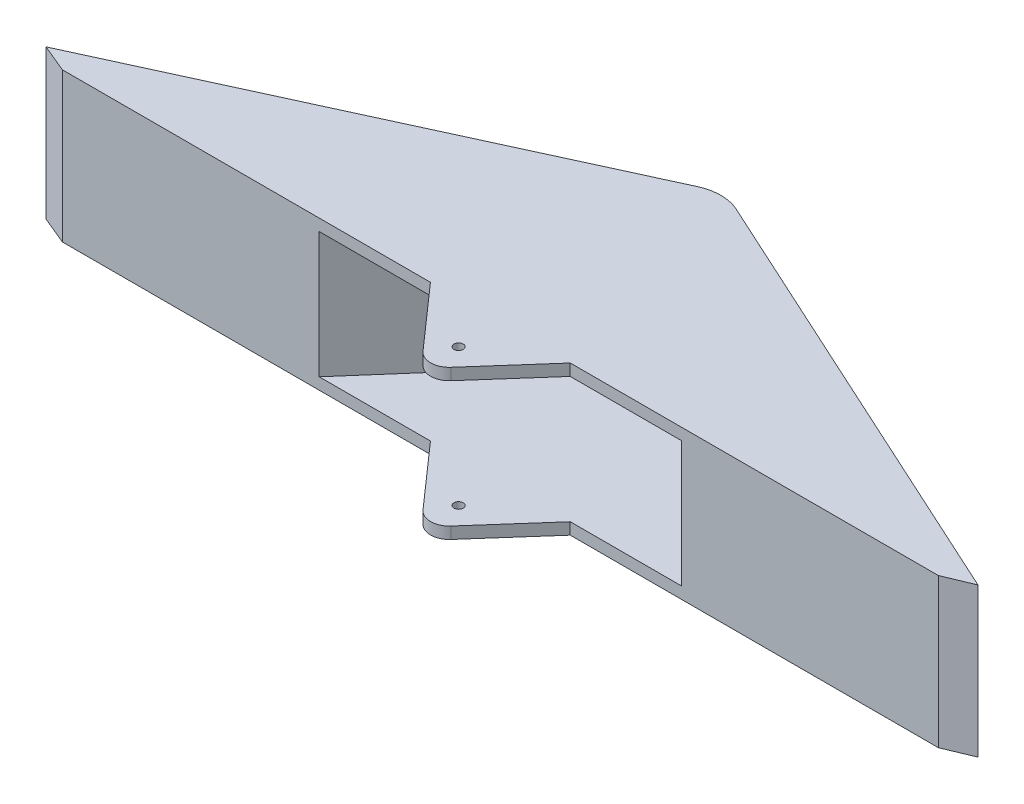
ISO-10303-21;
HEADER;
FILE_DESCRIPTION(('STEP AP214'),'2;1');
FILE_NAME('part.step','',(''),(''),'','','');
FILE_SCHEMA(('AUTOMOTIVE_DESIGN { 1 0 10303 214 1 1 1 1 }'));
ENDSEC;
DATA;
#1=APPLICATION_CONTEXT('core data for automotive mechanical design processes');
#2=APPLICATION_PROTOCOL_DEFINITION('international standard','automotive_design',2000,#1);
#3=PRODUCT_CONTEXT('',#1,'mechanical');
#4=PRODUCT('Part','Part','',(#3));
#5=PRODUCT_RELATED_PRODUCT_CATEGORY('part','',(#4));
#6=PRODUCT_DEFINITION_FORMATION('','',#4);
#7=PRODUCT_DEFINITION_CONTEXT('part definition',#1,'design');
#8=PRODUCT_DEFINITION('design','',#6,#7);
#9=PRODUCT_DEFINITION_SHAPE('','',#8);
#10=(LENGTH_UNIT() NAMED_UNIT(*) SI_UNIT(.MILLI.,.METRE.));
#11=(NAMED_UNIT(*) PLANE_ANGLE_UNIT() SI_UNIT($,.RADIAN.));
#12=(NAMED_UNIT(*) SI_UNIT($,.STERADIAN.) SOLID_ANGLE_UNIT());
#13=UNCERTAINTY_MEASURE_WITH_UNIT(LENGTH_MEASURE(1.E-05),#10,'distance_accuracy_value','');
#14=(GEOMETRIC_REPRESENTATION_CONTEXT(3) GLOBAL_UNCERTAINTY_ASSIGNED_CONTEXT((#13)) GLOBAL_UNIT_ASSIGNED_CONTEXT((#10,
#11,#12)) REPRESENTATION_CONTEXT('',''));
#15=CARTESIAN_POINT('',(0.,0.,0.));
#16=DIRECTION('',(0.,0.,1.));
#17=DIRECTION('',(1.,0.,0.));
#18=AXIS2_PLACEMENT_3D('',#15,#16,#17);
#19=CARTESIAN_POINT('',(-50.,118.756766424241,1.25));
#20=DIRECTION('',(0.,0.,-1.));
#21=DIRECTION('',(-1.,0.,0.));
#22=AXIS2_PLACEMENT_3D('',#19,#20,#21);
#23=PLANE('',#22);
#24=DIRECTION('',(0.,1.,0.));
#25=VECTOR('',#24,1.);
#26=CARTESIAN_POINT('',(-7.5,14.75,1.25));
#27=LINE('',#26,#25);
#28=CARTESIAN_POINT('',(-7.5,14.75,1.25));
#29=VERTEX_POINT('',#28);
#30=CARTESIAN_POINT('',(-7.5,16.,1.25000000000001));
#31=VERTEX_POINT('',#30);
#32=EDGE_CURVE('E57',#29,#31,#27,.T.);
#33=ORIENTED_EDGE('',*,*,#32,.T.);
#34=DIRECTION('',(1.,0.,0.));
#35=VECTOR('',#34,1.);
#36=CARTESIAN_POINT('',(50.,16.,1.25));
#37=LINE('',#36,#35);
#38=CARTESIAN_POINT('',(-47.,16.,1.25));
#39=VERTEX_POINT('',#38);
#40=EDGE_CURVE('E338',#39,#31,#37,.T.);
#41=ORIENTED_EDGE('',*,*,#40,.F.);
#42=DIRECTION('',(0.,-1.,0.));
#43=VECTOR('',#42,1.);
#44=CARTESIAN_POINT('',(-47.,118.756766424241,1.25));
#45=LINE('',#44,#43);
#46=CARTESIAN_POINT('',(-47.,0.,1.25));
#47=VERTEX_POINT('',#46);
#48=EDGE_CURVE('E346',#39,#47,#45,.T.);
#49=ORIENTED_EDGE('',*,*,#48,.T.);
#50=DIRECTION('',(-1.,0.,0.));
#51=VECTOR('',#50,1.);
#52=CARTESIAN_POINT('',(-50.,0.,1.25));
#53=LINE('',#52,#51);
#54=CARTESIAN_POINT('',(-7.5,0.,1.25));
#55=VERTEX_POINT('',#54);
#56=EDGE_CURVE('E335',#55,#47,#53,.T.);
#57=ORIENTED_EDGE('',*,*,#56,.F.);
#58=DIRECTION('',(0.,-1.,0.));
#59=VECTOR('',#58,1.);
#60=CARTESIAN_POINT('',(-7.5,1.25,1.25));
#61=LINE('',#60,#59);
#62=CARTESIAN_POINT('',(-7.5,1.25,1.25));
#63=VERTEX_POINT('',#62);
#64=EDGE_CURVE('E243',#63,#55,#61,.T.);
#65=ORIENTED_EDGE('',*,*,#64,.F.);
#66=DIRECTION('',(1.,0.,0.));
#67=VECTOR('',#66,1.);
#68=CARTESIAN_POINT('',(19.4318799434697,1.25,1.25000000000001));
#69=LINE('',#68,#67);
#70=CARTESIAN_POINT('',(-19.4318799434697,1.25,1.25));
#71=VERTEX_POINT('',#70);
#72=EDGE_CURVE('E284',#71,#63,#69,.T.);
#73=ORIENTED_EDGE('',*,*,#72,.F.);
#74=DIRECTION('',(0.,-1.,0.));
#75=VECTOR('',#74,1.);
#76=CARTESIAN_POINT('',(-19.4318799434697,118.756766424241,1.25));
#77=LINE('',#76,#75);
#78=CARTESIAN_POINT('',(-19.4318799434697,14.75,1.25));
#79=VERTEX_POINT('',#78);
#80=EDGE_CURVE('E405',#79,#71,#77,.T.);
#81=ORIENTED_EDGE('',*,*,#80,.F.);
#82=DIRECTION('',(1.,0.,0.));
#83=VECTOR('',#82,1.);
#84=CARTESIAN_POINT('',(19.4318799434697,14.75,1.25000000000001));
#85=LINE('',#84,#83);
#86=EDGE_CURVE('E294',#79,#29,#85,.T.);
#87=ORIENTED_EDGE('',*,*,#86,.T.);
#88=EDGE_LOOP('',(#33,#41,#49,#57,#65,#73,#81,#87));
#89=FACE_BOUND('',#88,.T.);
#90=ADVANCED_FACE('F32',(#89),#23,.F.);
#91=DIRECTION('',(0.,1.,0.));
#92=VECTOR('',#91,1.);
#93=CARTESIAN_POINT('',(7.5,14.75,1.25));
#94=LINE('',#93,#92);
#95=CARTESIAN_POINT('',(7.5,14.75,1.25));
#96=VERTEX_POINT('',#95);
#97=CARTESIAN_POINT('',(7.5,16.,1.25000000000001));
#98=VERTEX_POINT('',#97);
#99=EDGE_CURVE('E237',#96,#98,#94,.T.);
#100=ORIENTED_EDGE('',*,*,#99,.F.);
#101=CARTESIAN_POINT('',(19.4318799434697,14.75,1.25000000000001));
#102=VERTEX_POINT('',#101);
#103=EDGE_CURVE('E293',#96,#102,#85,.T.);
#104=ORIENTED_EDGE('',*,*,#103,.T.);
#105=DIRECTION('',(0.,-1.,0.));
#106=VECTOR('',#105,1.);
#107=CARTESIAN_POINT('',(19.4318799434697,118.756766424241,1.25000000000001));
#108=LINE('',#107,#106);
#109=CARTESIAN_POINT('',(19.4318799434697,1.25,1.25000000000001));
#110=VERTEX_POINT('',#109);
#111=EDGE_CURVE('E399',#102,#110,#108,.T.);
#112=ORIENTED_EDGE('',*,*,#111,.T.);
#113=CARTESIAN_POINT('',(7.5,1.25,1.25));
#114=VERTEX_POINT('',#113);
#115=EDGE_CURVE('E252',#114,#110,#69,.T.);
#116=ORIENTED_EDGE('',*,*,#115,.F.);
#117=DIRECTION('',(0.,-1.,0.));
#118=VECTOR('',#117,1.);
#119=CARTESIAN_POINT('',(7.5,1.25,1.25));
#120=LINE('',#119,#118);
#121=CARTESIAN_POINT('',(7.5,0.,1.25));
#122=VERTEX_POINT('',#121);
#123=EDGE_CURVE('E255',#114,#122,#120,.T.);
#124=ORIENTED_EDGE('',*,*,#123,.T.);
#125=CARTESIAN_POINT('',(46.9999999999999,0.,1.25));
#126=VERTEX_POINT('',#125);
#127=EDGE_CURVE('E342',#126,#122,#53,.T.);
#128=ORIENTED_EDGE('',*,*,#127,.F.);
#129=DIRECTION('',(0.,1.,0.));
#130=VECTOR('',#129,1.);
#131=CARTESIAN_POINT('',(46.9999999999999,118.756766424241,1.25));
#132=LINE('',#131,#130);
#133=CARTESIAN_POINT('',(47.0000000000001,16.,1.24999999999998));
#134=VERTEX_POINT('',#133);
#135=EDGE_CURVE('E351',#126,#134,#132,.T.);
#136=ORIENTED_EDGE('',*,*,#135,.T.);
#137=EDGE_CURVE('E49',#98,#134,#37,.T.);
#138=ORIENTED_EDGE('',*,*,#137,.F.);
#139=EDGE_LOOP('',(#100,#104,#112,#116,#124,#128,#136,#138));
#140=FACE_BOUND('',#139,.T.);
#141=ADVANCED_FACE('F459',(#140),#23,.F.);
#142=CARTESIAN_POINT('',(20.,118.756766424241,0.));
#143=DIRECTION('',(0.,0.,1.));
#144=DIRECTION('',(1.,0.,0.));
#145=AXIS2_PLACEMENT_3D('',#142,#143,#144);
#146=PLANE('',#145);
#147=DIRECTION('',(1.,0.,0.));
#148=VECTOR('',#147,1.);
#149=CARTESIAN_POINT('',(20.,14.75,0.));
#150=LINE('',#149,#148);
#151=CARTESIAN_POINT('',(20.,14.75,0.));
#152=VERTEX_POINT('',#151);
#153=CARTESIAN_POINT('',(50.,14.75,0.));
#154=VERTEX_POINT('',#153);
#155=EDGE_CURVE('E322',#152,#154,#150,.T.);
#156=ORIENTED_EDGE('',*,*,#155,.T.);
#157=DIRECTION('',(0.,-1.,0.));
#158=VECTOR('',#157,1.);
#159=CARTESIAN_POINT('',(50.,118.756766424241,0.));
#160=LINE('',#159,#158);
#161=CARTESIAN_POINT('',(50.,1.25,0.));
#162=VERTEX_POINT('',#161);
#163=EDGE_CURVE('E343',#154,#162,#160,.T.);
#164=ORIENTED_EDGE('',*,*,#163,.T.);
#165=DIRECTION('',(1.,0.,0.));
#166=VECTOR('',#165,1.);
#167=CARTESIAN_POINT('',(20.,1.25,0.));
#168=LINE('',#167,#166);
#169=CARTESIAN_POINT('',(20.,1.25,0.));
#170=VERTEX_POINT('',#169);
#171=EDGE_CURVE('E381',#170,#162,#168,.T.);
#172=ORIENTED_EDGE('',*,*,#171,.F.);
#173=DIRECTION('',(0.,-1.,0.));
#174=VECTOR('',#173,1.);
#175=CARTESIAN_POINT('',(20.,118.756766424241,0.));
#176=LINE('',#175,#174);
#177=EDGE_CURVE('E398',#152,#170,#176,.T.);
#178=ORIENTED_EDGE('',*,*,#177,.F.);
#179=EDGE_LOOP('',(#156,#164,#172,#178));
#180=FACE_BOUND('',#179,.T.);
#181=ADVANCED_FACE('F428',(#180),#146,.F.);
#182=CARTESIAN_POINT('',(0.753370803500888,118.756766424241,-22.0497837914261));
#183=DIRECTION('',(-0.753370803500884,0.,0.657595949221429));
#184=DIRECTION('',(0.657595949221429,0.,0.753370803500884));
#185=AXIS2_PLACEMENT_3D('',#182,#183,#184);
#186=PLANE('',#185);
#187=DIRECTION('',(0.657595949221429,0.,0.753370803500884));
#188=VECTOR('',#187,1.);
#189=CARTESIAN_POINT('',(0.753370803500888,14.75,-22.0497837914261));
#190=LINE('',#189,#188);
#191=CARTESIAN_POINT('',(0.753370803500888,14.75,-22.0497837914261));
#192=VERTEX_POINT('',#191);
#193=EDGE_CURVE('E319',#192,#152,#190,.T.);
#194=ORIENTED_EDGE('',*,*,#193,.T.);
#195=ORIENTED_EDGE('',*,*,#177,.T.);
#196=DIRECTION('',(0.657595949221429,0.,0.753370803500884));
#197=VECTOR('',#196,1.);
#198=CARTESIAN_POINT('',(0.753370803500888,1.25,-22.0497837914261));
#199=LINE('',#198,#197);
#200=CARTESIAN_POINT('',(0.753370803500888,1.25,-22.0497837914261));
#201=VERTEX_POINT('',#200);
#202=EDGE_CURVE('E384',#201,#170,#199,.T.);
#203=ORIENTED_EDGE('',*,*,#202,.F.);
#204=DIRECTION('',(0.,-1.,0.));
#205=VECTOR('',#204,1.);
#206=CARTESIAN_POINT('',(0.753370803500888,118.756766424241,-22.0497837914261));
#207=LINE('',#206,#205);
#208=EDGE_CURVE('E416',#192,#201,#207,.T.);
#209=ORIENTED_EDGE('',*,*,#208,.F.);
#210=EDGE_LOOP('',(#194,#195,#203,#209));
#211=FACE_BOUND('',#210,.T.);
#212=ADVANCED_FACE('F420',(#211),#186,.F.);
#213=CARTESIAN_POINT('',(0.,118.756766424241,-21.3921878422046));
#214=DIRECTION('',(0.,-1.,0.));
#215=DIRECTION('',(0.,0.,-1.));
#216=AXIS2_PLACEMENT_3D('',#213,#214,#215);
#217=CYLINDRICAL_SURFACE('',#216,1.);
#218=CARTESIAN_POINT('',(0.,14.75,-21.3921878422046));
#219=DIRECTION('',(0.,-1.,0.));
#220=DIRECTION('',(0.,0.,1.));
#221=AXIS2_PLACEMENT_3D('',#218,#219,#220);
#222=CIRCLE('',#221,1.);
#223=CARTESIAN_POINT('',(-0.753370803500882,14.75,-22.0497837914261));
#224=VERTEX_POINT('',#223);
#225=EDGE_CURVE('E316',#224,#192,#222,.T.);
#226=ORIENTED_EDGE('',*,*,#225,.T.);
#227=ORIENTED_EDGE('',*,*,#208,.T.);
#228=CARTESIAN_POINT('',(0.,1.25,-21.3921878422046));
#229=DIRECTION('',(0.,-1.,0.));
#230=DIRECTION('',(0.,0.,1.));
#231=AXIS2_PLACEMENT_3D('',#228,#229,#230);
#232=CIRCLE('',#231,1.);
#233=CARTESIAN_POINT('',(-0.753370803500882,1.25,-22.0497837914261));
#234=VERTEX_POINT('',#233);
#235=EDGE_CURVE('E387',#234,#201,#232,.T.);
#236=ORIENTED_EDGE('',*,*,#235,.F.);
#237=DIRECTION('',(0.,-1.,0.));
#238=VECTOR('',#237,1.);
#239=CARTESIAN_POINT('',(-0.753370803500882,118.756766424241,-22.0497837914261));
#240=LINE('',#239,#238);
#241=EDGE_CURVE('E414',#224,#234,#240,.T.);
#242=ORIENTED_EDGE('',*,*,#241,.F.);
#243=EDGE_LOOP('',(#226,#227,#236,#242));
#244=FACE_BOUND('',#243,.T.);
#245=ADVANCED_FACE('F533',(#244),#217,.T.);
#246=CARTESIAN_POINT('',(-20.,118.756766424241,0.));
#247=DIRECTION('',(0.753370803500884,0.,0.65759594922143));
#248=DIRECTION('',(0.65759594922143,0.,-0.753370803500884));
#249=AXIS2_PLACEMENT_3D('',#246,#247,#248);
#250=PLANE('',#249);
#251=DIRECTION('',(0.65759594922143,0.,-0.753370803500884));
#252=VECTOR('',#251,1.);
#253=CARTESIAN_POINT('',(-0.753370803500882,14.75,-22.0497837914261));
#254=LINE('',#253,#252);
#255=CARTESIAN_POINT('',(-20.,14.75,0.));
#256=VERTEX_POINT('',#255);
#257=EDGE_CURVE('E313',#256,#224,#254,.T.);
#258=ORIENTED_EDGE('',*,*,#257,.T.);
#259=ORIENTED_EDGE('',*,*,#241,.T.);
#260=DIRECTION('',(0.65759594922143,0.,-0.753370803500884));
#261=VECTOR('',#260,1.);
#262=CARTESIAN_POINT('',(-0.753370803500882,1.25,-22.0497837914261));
#263=LINE('',#262,#261);
#264=CARTESIAN_POINT('',(-20.,1.25,0.));
#265=VERTEX_POINT('',#264);
#266=EDGE_CURVE('E390',#265,#234,#263,.T.);
#267=ORIENTED_EDGE('',*,*,#266,.F.);
#268=DIRECTION('',(0.,-1.,0.));
#269=VECTOR('',#268,1.);
#270=CARTESIAN_POINT('',(-20.,118.756766424241,0.));
#271=LINE('',#270,#269);
#272=EDGE_CURVE('E412',#256,#265,#271,.T.);
#273=ORIENTED_EDGE('',*,*,#272,.F.);
#274=EDGE_LOOP('',(#258,#259,#267,#273));
#275=FACE_BOUND('',#274,.T.);
#276=ADVANCED_FACE('F530',(#275),#250,.F.);
#277=CARTESIAN_POINT('',(-50.,118.756766424241,0.));
#278=DIRECTION('',(0.,0.,1.));
#279=DIRECTION('',(1.,0.,0.));
#280=AXIS2_PLACEMENT_3D('',#277,#278,#279);
#281=PLANE('',#280);
#282=DIRECTION('',(1.,0.,0.));
#283=VECTOR('',#282,1.);
#284=CARTESIAN_POINT('',(-20.,14.75,0.));
#285=LINE('',#284,#283);
#286=CARTESIAN_POINT('',(-50.,14.75,0.));
#287=VERTEX_POINT('',#286);
#288=EDGE_CURVE('E302',#287,#256,#285,.T.);
#289=ORIENTED_EDGE('',*,*,#288,.T.);
#290=ORIENTED_EDGE('',*,*,#272,.T.);
#291=DIRECTION('',(1.,0.,0.));
#292=VECTOR('',#291,1.);
#293=CARTESIAN_POINT('',(-20.,1.25,0.));
#294=LINE('',#293,#292);
#295=CARTESIAN_POINT('',(-50.,1.25,0.));
#296=VERTEX_POINT('',#295);
#297=EDGE_CURVE('E371',#296,#265,#294,.T.);
#298=ORIENTED_EDGE('',*,*,#297,.F.);
#299=DIRECTION('',(0.,-1.,0.));
#300=VECTOR('',#299,1.);
#301=CARTESIAN_POINT('',(-50.,118.756766424241,0.));
#302=LINE('',#301,#300);
#303=EDGE_CURVE('E411',#287,#296,#302,.T.);
#304=ORIENTED_EDGE('',*,*,#303,.F.);
#305=EDGE_LOOP('',(#289,#290,#298,#304));
#306=FACE_BOUND('',#305,.T.);
#307=ADVANCED_FACE('F483',(#306),#281,.F.);
#308=CARTESIAN_POINT('',(50.,1.25,0.));
#309=DIRECTION('',(-0.416597790450531,0.,0.909090909090909));
#310=DIRECTION('',(0.909090909090909,0.,0.416597790450531));
#311=AXIS2_PLACEMENT_3D('',#308,#309,#310);
#312=PLANE('',#311);
#313=DIRECTION('',(-0.909090909090909,0.,-0.416597790450531));
#314=VECTOR('',#313,1.);
#315=CARTESIAN_POINT('',(50.,0.,0.));
#316=LINE('',#315,#314);
#317=CARTESIAN_POINT('',(50.,0.,0.));
#318=VERTEX_POINT('',#317);
#319=CARTESIAN_POINT('',(2.08298895225268,0.,-21.9583330202337));
#320=VERTEX_POINT('',#319);
#321=EDGE_CURVE('E374',#318,#320,#316,.T.);
#322=ORIENTED_EDGE('',*,*,#321,.T.);
#323=DIRECTION('',(0.,-1.,0.));
#324=VECTOR('',#323,1.);
#325=CARTESIAN_POINT('',(2.08298895225268,1.25,-21.9583330202337));
#326=LINE('',#325,#324);
#327=CARTESIAN_POINT('',(2.08298895225268,1.25,-21.9583330202337));
#328=VERTEX_POINT('',#327);
#329=EDGE_CURVE('E358',#328,#320,#326,.T.);
#330=ORIENTED_EDGE('',*,*,#329,.F.);
#331=DIRECTION('',(-0.909090909090909,0.,-0.416597790450531));
#332=VECTOR('',#331,1.);
#333=CARTESIAN_POINT('',(50.,1.25,0.));
#334=LINE('',#333,#332);
#335=EDGE_CURVE('E379',#162,#328,#334,.T.);
#336=ORIENTED_EDGE('',*,*,#335,.F.);
#337=DIRECTION('',(0.,-1.,0.));
#338=VECTOR('',#337,1.);
#339=CARTESIAN_POINT('',(50.,1.25,0.));
#340=LINE('',#339,#338);
#341=EDGE_CURVE('E356',#162,#318,#340,.T.);
#342=ORIENTED_EDGE('',*,*,#341,.T.);
#343=EDGE_LOOP('',(#322,#330,#336,#342));
#344=FACE_BOUND('',#343,.T.);
#345=ADVANCED_FACE('F467',(#344),#312,.F.);
#346=CARTESIAN_POINT('',(0.,1.25,-17.4128784747792));
#347=DIRECTION('',(0.,-1.,0.));
#348=DIRECTION('',(0.,0.,-1.));
#349=AXIS2_PLACEMENT_3D('',#346,#347,#348);
#350=CYLINDRICAL_SURFACE('',#349,5.);
#351=CARTESIAN_POINT('',(0.,0.,-17.4128784747792));
#352=DIRECTION('',(0.,1.,0.));
#353=DIRECTION('',(0.,0.,1.));
#354=AXIS2_PLACEMENT_3D('',#351,#352,#353);
#355=CIRCLE('',#354,5.);
#356=CARTESIAN_POINT('',(-2.08298895225267,0.,-21.9583330202337));
#357=VERTEX_POINT('',#356);
#358=EDGE_CURVE('E372',#320,#357,#355,.T.);
#359=ORIENTED_EDGE('',*,*,#358,.T.);
#360=DIRECTION('',(0.,-1.,0.));
#361=VECTOR('',#360,1.);
#362=CARTESIAN_POINT('',(-2.08298895225267,1.25,-21.9583330202337));
#363=LINE('',#362,#361);
#364=CARTESIAN_POINT('',(-2.08298895225267,1.25,-21.9583330202337));
#365=VERTEX_POINT('',#364);
#366=EDGE_CURVE('E361',#365,#357,#363,.T.);
#367=ORIENTED_EDGE('',*,*,#366,.F.);
#368=CARTESIAN_POINT('',(0.,1.25,-17.4128784747792));
#369=DIRECTION('',(0.,1.,0.));
#370=DIRECTION('',(0.,0.,1.));
#371=AXIS2_PLACEMENT_3D('',#368,#369,#370);
#372=CIRCLE('',#371,5.);
#373=EDGE_CURVE('E377',#328,#365,#372,.T.);
#374=ORIENTED_EDGE('',*,*,#373,.F.);
#375=ORIENTED_EDGE('',*,*,#329,.T.);
#376=EDGE_LOOP('',(#359,#367,#374,#375));
#377=FACE_BOUND('',#376,.T.);
#378=ADVANCED_FACE('F470',(#377),#350,.T.);
#379=CARTESIAN_POINT('',(-50.,1.25,0.));
#380=DIRECTION('',(0.416597790450531,0.,0.909090909090909));
#381=DIRECTION('',(0.909090909090909,0.,-0.416597790450531));
#382=AXIS2_PLACEMENT_3D('',#379,#380,#381);
#383=PLANE('',#382);
#384=DIRECTION('',(-0.909090909090909,0.,0.416597790450531));
#385=VECTOR('',#384,1.);
#386=CARTESIAN_POINT('',(-50.,0.,0.));
#387=LINE('',#386,#385);
#388=CARTESIAN_POINT('',(-50.,0.,0.));
#389=VERTEX_POINT('',#388);
#390=EDGE_CURVE('E368',#357,#389,#387,.T.);
#391=ORIENTED_EDGE('',*,*,#390,.T.);
#392=DIRECTION('',(0.,-1.,0.));
#393=VECTOR('',#392,1.);
#394=CARTESIAN_POINT('',(-50.,1.25,0.));
#395=LINE('',#394,#393);
#396=EDGE_CURVE('E364',#296,#389,#395,.T.);
#397=ORIENTED_EDGE('',*,*,#396,.F.);
#398=DIRECTION('',(-0.909090909090909,0.,0.416597790450531));
#399=VECTOR('',#398,1.);
#400=CARTESIAN_POINT('',(-50.,1.25,0.));
#401=LINE('',#400,#399);
#402=EDGE_CURVE('E367',#365,#296,#401,.T.);
#403=ORIENTED_EDGE('',*,*,#402,.F.);
#404=ORIENTED_EDGE('',*,*,#366,.T.);
#405=EDGE_LOOP('',(#391,#397,#403,#404));
#406=FACE_BOUND('',#405,.T.);
#407=ADVANCED_FACE('F477',(#406),#383,.F.);
#408=CARTESIAN_POINT('',(0.,1.25,-17.4128784747792));
#409=DIRECTION('',(0.,1.,0.));
#410=DIRECTION('',(0.,0.,1.));
#411=AXIS2_PLACEMENT_3D('',#408,#409,#410);
#412=PLANE('',#411);
#413=ORIENTED_EDGE('',*,*,#297,.T.);
#414=ORIENTED_EDGE('',*,*,#266,.T.);
#415=ORIENTED_EDGE('',*,*,#235,.T.);
#416=ORIENTED_EDGE('',*,*,#202,.T.);
#417=ORIENTED_EDGE('',*,*,#171,.T.);
#418=ORIENTED_EDGE('',*,*,#335,.T.);
#419=ORIENTED_EDGE('',*,*,#373,.T.);
#420=ORIENTED_EDGE('',*,*,#402,.T.);
#421=EDGE_LOOP('',(#413,#414,#415,#416,#417,#418,#419,#420));
#422=FACE_BOUND('',#421,.T.);
#423=ADVANCED_FACE('F425',(#422),#412,.T.);
#424=CARTESIAN_POINT('',(0.,0.,-17.4128784747792));
#425=DIRECTION('',(0.,1.,0.));
#426=DIRECTION('',(0.,0.,1.));
#427=AXIS2_PLACEMENT_3D('',#424,#425,#426);
#428=PLANE('',#427);
#429=CARTESIAN_POINT('',(0.,0.,5.72712425366543));
#430=DIRECTION('',(0.,-1.,0.));
#431=DIRECTION('',(0.,0.,-1.));
#432=AXIS2_PLACEMENT_3D('',#429,#430,#431);
#433=CIRCLE('',#432,0.5);
#434=CARTESIAN_POINT('',(0.,0.,5.22712425366543));
#435=VERTEX_POINT('',#434);
#436=EDGE_CURVE('E683',#435,#435,#433,.T.);
#437=ORIENTED_EDGE('',*,*,#436,.F.);
#438=EDGE_LOOP('',(#437));
#439=FACE_BOUND('',#438,.T.);
#440=DIRECTION('',(0.923076923076924,0.,-0.384615384615382));
#441=VECTOR('',#440,1.);
#442=CARTESIAN_POINT('',(50.,0.,0.));
#443=LINE('',#442,#441);
#444=EDGE_CURVE('E353',#318,#126,#443,.F.);
#445=ORIENTED_EDGE('',*,*,#444,.T.);
#446=ORIENTED_EDGE('',*,*,#127,.T.);
#447=DIRECTION('',(-0.661621637086846,0.,0.749837855365092));
#448=VECTOR('',#447,1.);
#449=CARTESIAN_POINT('',(7.5,0.,1.25));
#450=LINE('',#449,#448);
#451=CARTESIAN_POINT('',(1.4996757107302,0.,8.05036752783912));
#452=VERTEX_POINT('',#451);
#453=EDGE_CURVE('E249',#122,#452,#450,.T.);
#454=ORIENTED_EDGE('',*,*,#453,.T.);
#455=CARTESIAN_POINT('',(0.,0.,6.72712425366543));
#456=DIRECTION('',(0.,-1.,0.));
#457=DIRECTION('',(0.,0.,-1.));
#458=AXIS2_PLACEMENT_3D('',#455,#456,#457);
#459=CIRCLE('',#458,2.);
#460=CARTESIAN_POINT('',(-1.4996757107302,0.,8.05036752783911));
#461=VERTEX_POINT('',#460);
#462=EDGE_CURVE('E245',#452,#461,#459,.T.);
#463=ORIENTED_EDGE('',*,*,#462,.T.);
#464=DIRECTION('',(-0.661621637086846,0.,-0.749837855365093));
#465=VECTOR('',#464,1.);
#466=CARTESIAN_POINT('',(-1.4996757107302,0.,8.05036752783911));
#467=LINE('',#466,#465);
#468=EDGE_CURVE('E236',#461,#55,#467,.T.);
#469=ORIENTED_EDGE('',*,*,#468,.T.);
#470=ORIENTED_EDGE('',*,*,#56,.T.);
#471=DIRECTION('',(0.923076923076924,0.,0.384615384615383));
#472=VECTOR('',#471,1.);
#473=CARTESIAN_POINT('',(-47.,0.,1.25));
#474=LINE('',#473,#472);
#475=EDGE_CURVE('E41',#47,#389,#474,.F.);
#476=ORIENTED_EDGE('',*,*,#475,.T.);
#477=ORIENTED_EDGE('',*,*,#390,.F.);
#478=ORIENTED_EDGE('',*,*,#358,.F.);
#479=ORIENTED_EDGE('',*,*,#321,.F.);
#480=EDGE_LOOP('',(#445,#446,#454,#463,#469,#470,#476,#477,#478,#479));
#481=FACE_BOUND('',#480,.T.);
#482=ADVANCED_FACE('F462',(#439,#481),#428,.F.);
#483=CARTESIAN_POINT('',(-19.4318799434697,118.756766424241,1.25));
#484=DIRECTION('',(-0.753370803500884,0.,-0.657595949221429));
#485=DIRECTION('',(-0.65759594922143,0.,0.753370803500884));
#486=AXIS2_PLACEMENT_3D('',#483,#484,#485);
#487=PLANE('',#486);
#488=ORIENTED_EDGE('',*,*,#80,.T.);
#489=DIRECTION('',(-0.657595949221429,0.,0.753370803500883));
#490=VECTOR('',#489,1.);
#491=CARTESIAN_POINT('',(-19.4318799434697,1.25,1.25));
#492=LINE('',#491,#490);
#493=CARTESIAN_POINT('',(0.,1.25,-21.012015184061));
#494=VERTEX_POINT('',#493);
#495=EDGE_CURVE('E288',#494,#71,#492,.T.);
#496=ORIENTED_EDGE('',*,*,#495,.F.);
#497=DIRECTION('',(0.,-1.,0.));
#498=VECTOR('',#497,1.);
#499=CARTESIAN_POINT('',(0.,118.756766424241,-21.012015184061));
#500=LINE('',#499,#498);
#501=CARTESIAN_POINT('',(0.,14.75,-21.012015184061));
#502=VERTEX_POINT('',#501);
#503=EDGE_CURVE('E402',#502,#494,#500,.T.);
#504=ORIENTED_EDGE('',*,*,#503,.F.);
#505=DIRECTION('',(-0.657595949221429,0.,0.753370803500883));
#506=VECTOR('',#505,1.);
#507=CARTESIAN_POINT('',(-19.4318799434697,14.75,1.25));
#508=LINE('',#507,#506);
#509=EDGE_CURVE('E299',#502,#79,#508,.T.);
#510=ORIENTED_EDGE('',*,*,#509,.T.);
#511=EDGE_LOOP('',(#488,#496,#504,#510));
#512=FACE_BOUND('',#511,.T.);
#513=ADVANCED_FACE('F501',(#512),#487,.F.);
#514=CARTESIAN_POINT('',(19.4318799434697,118.756766424241,1.25000000000001));
#515=DIRECTION('',(0.753370803500883,0.,-0.65759594922143));
#516=DIRECTION('',(-0.65759594922143,0.,-0.753370803500883));
#517=AXIS2_PLACEMENT_3D('',#514,#515,#516);
#518=PLANE('',#517);
#519=ORIENTED_EDGE('',*,*,#503,.T.);
#520=DIRECTION('',(-0.65759594922143,0.,-0.753370803500883));
#521=VECTOR('',#520,1.);
#522=CARTESIAN_POINT('',(0.,1.25,-21.012015184061));
#523=LINE('',#522,#521);
#524=EDGE_CURVE('E291',#110,#494,#523,.T.);
#525=ORIENTED_EDGE('',*,*,#524,.F.);
#526=ORIENTED_EDGE('',*,*,#111,.F.);
#527=DIRECTION('',(-0.65759594922143,0.,-0.753370803500883));
#528=VECTOR('',#527,1.);
#529=CARTESIAN_POINT('',(0.,14.75,-21.012015184061));
#530=LINE('',#529,#528);
#531=EDGE_CURVE('E296',#102,#502,#530,.T.);
#532=ORIENTED_EDGE('',*,*,#531,.T.);
#533=EDGE_LOOP('',(#519,#525,#526,#532));
#534=FACE_BOUND('',#533,.T.);
#535=ADVANCED_FACE('F493',(#534),#518,.F.);
#536=CARTESIAN_POINT('',(0.,16.,-17.4128784747792));
#537=DIRECTION('',(0.,1.,0.));
#538=DIRECTION('',(0.,0.,1.));
#539=AXIS2_PLACEMENT_3D('',#536,#537,#538);
#540=PLANE('',#539);
#541=CARTESIAN_POINT('',(0.,16.,5.72712425366543));
#542=DIRECTION('',(0.,1.,0.));
#543=DIRECTION('',(0.,0.,1.));
#544=AXIS2_PLACEMENT_3D('',#541,#542,#543);
#545=CIRCLE('',#544,0.5);
#546=CARTESIAN_POINT('',(0.,16.,6.22712425366543));
#547=VERTEX_POINT('',#546);
#548=EDGE_CURVE('E682',#547,#547,#545,.F.);
#549=ORIENTED_EDGE('',*,*,#548,.T.);
#550=EDGE_LOOP('',(#549));
#551=FACE_BOUND('',#550,.T.);
#552=DIRECTION('',(-0.909090909090909,0.,0.416597790450531));
#553=VECTOR('',#552,1.);
#554=CARTESIAN_POINT('',(-50.,16.,0.));
#555=LINE('',#554,#553);
#556=CARTESIAN_POINT('',(-2.08298895225267,16.,-21.9583330202337));
#557=VERTEX_POINT('',#556);
#558=CARTESIAN_POINT('',(-50.,16.,0.));
#559=VERTEX_POINT('',#558);
#560=EDGE_CURVE('E308',#557,#559,#555,.T.);
#561=ORIENTED_EDGE('',*,*,#560,.T.);
#562=DIRECTION('',(-0.923076923076924,0.,-0.384615384615383));
#563=VECTOR('',#562,1.);
#564=CARTESIAN_POINT('',(-13.5785367366079,16.,15.17560969308));
#565=LINE('',#564,#563);
#566=EDGE_CURVE('E11',#559,#39,#565,.F.);
#567=ORIENTED_EDGE('',*,*,#566,.T.);
#568=ORIENTED_EDGE('',*,*,#40,.T.);
#569=DIRECTION('',(-0.661621637086846,0.,-0.749837855365093));
#570=VECTOR('',#569,1.);
#571=CARTESIAN_POINT('',(-1.4996757107302,16.,8.05036752783911));
#572=LINE('',#571,#570);
#573=CARTESIAN_POINT('',(-1.4996757107302,16.,8.05036752783911));
#574=VERTEX_POINT('',#573);
#575=EDGE_CURVE('E232',#574,#31,#572,.T.);
#576=ORIENTED_EDGE('',*,*,#575,.F.);
#577=CARTESIAN_POINT('',(0.,16.,6.72712425366543));
#578=DIRECTION('',(0.,-1.,0.));
#579=DIRECTION('',(0.,0.,-1.));
#580=AXIS2_PLACEMENT_3D('',#577,#578,#579);
#581=CIRCLE('',#580,2.);
#582=CARTESIAN_POINT('',(1.4996757107302,16.,8.05036752783912));
#583=VERTEX_POINT('',#582);
#584=EDGE_CURVE('E217',#583,#574,#581,.T.);
#585=ORIENTED_EDGE('',*,*,#584,.F.);
#586=DIRECTION('',(-0.661621637086846,0.,0.749837855365092));
#587=VECTOR('',#586,1.);
#588=CARTESIAN_POINT('',(7.5,16.,1.25));
#589=LINE('',#588,#587);
#590=EDGE_CURVE('E224',#98,#583,#589,.T.);
#591=ORIENTED_EDGE('',*,*,#590,.F.);
#592=ORIENTED_EDGE('',*,*,#137,.T.);
#593=DIRECTION('',(-0.923076923076924,0.,0.384615384615382));
#594=VECTOR('',#593,1.);
#595=CARTESIAN_POINT('',(13.5785367366079,16.,15.1756096930799));
#596=LINE('',#595,#594);
#597=CARTESIAN_POINT('',(50.,16.,0.));
#598=VERTEX_POINT('',#597);
#599=EDGE_CURVE('E349',#134,#598,#596,.F.);
#600=ORIENTED_EDGE('',*,*,#599,.T.);
#601=DIRECTION('',(-0.909090909090909,0.,-0.416597790450531));
#602=VECTOR('',#601,1.);
#603=CARTESIAN_POINT('',(50.,16.,0.));
#604=LINE('',#603,#602);
#605=CARTESIAN_POINT('',(2.08298895225268,16.,-21.9583330202337));
#606=VERTEX_POINT('',#605);
#607=EDGE_CURVE('E303',#598,#606,#604,.T.);
#608=ORIENTED_EDGE('',*,*,#607,.T.);
#609=CARTESIAN_POINT('',(0.,16.,-17.4128784747792));
#610=DIRECTION('',(0.,1.,0.));
#611=DIRECTION('',(0.,0.,1.));
#612=AXIS2_PLACEMENT_3D('',#609,#610,#611);
#613=CIRCLE('',#612,5.);
#614=EDGE_CURVE('E305',#606,#557,#613,.T.);
#615=ORIENTED_EDGE('',*,*,#614,.T.);
#616=EDGE_LOOP('',(#561,#567,#568,#576,#585,#591,#592,#600,#608,#615));
#617=FACE_BOUND('',#616,.T.);
#618=ADVANCED_FACE('F455',(#551,#617),#540,.T.);
#619=CARTESIAN_POINT('',(50.,16.,0.));
#620=DIRECTION('',(-0.416597790450531,0.,0.909090909090909));
#621=DIRECTION('',(0.909090909090909,0.,0.416597790450531));
#622=AXIS2_PLACEMENT_3D('',#619,#620,#621);
#623=PLANE('',#622);
#624=DIRECTION('',(-0.909090909090909,0.,-0.416597790450531));
#625=VECTOR('',#624,1.);
#626=CARTESIAN_POINT('',(50.,14.75,0.));
#627=LINE('',#626,#625);
#628=CARTESIAN_POINT('',(2.08298895225268,14.75,-21.9583330202337));
#629=VERTEX_POINT('',#628);
#630=EDGE_CURVE('E325',#154,#629,#627,.T.);
#631=ORIENTED_EDGE('',*,*,#630,.T.);
#632=DIRECTION('',(0.,-1.,0.));
#633=VECTOR('',#632,1.);
#634=CARTESIAN_POINT('',(2.08298895225268,16.,-21.9583330202337));
#635=LINE('',#634,#633);
#636=EDGE_CURVE('E332',#606,#629,#635,.T.);
#637=ORIENTED_EDGE('',*,*,#636,.F.);
#638=ORIENTED_EDGE('',*,*,#607,.F.);
#639=EDGE_CURVE('E395',#598,#154,#160,.T.);
#640=ORIENTED_EDGE('',*,*,#639,.T.);
#641=EDGE_LOOP('',(#631,#637,#638,#640));
#642=FACE_BOUND('',#641,.T.);
#643=ADVANCED_FACE('F438',(#642),#623,.F.);
#644=CARTESIAN_POINT('',(0.,16.,-17.4128784747792));
#645=DIRECTION('',(0.,-1.,0.));
#646=DIRECTION('',(0.,0.,-1.));
#647=AXIS2_PLACEMENT_3D('',#644,#645,#646);
#648=CYLINDRICAL_SURFACE('',#647,5.);
#649=CARTESIAN_POINT('',(0.,14.75,-17.4128784747792));
#650=DIRECTION('',(0.,1.,0.));
#651=DIRECTION('',(0.,0.,1.));
#652=AXIS2_PLACEMENT_3D('',#649,#650,#651);
#653=CIRCLE('',#652,5.);
#654=CARTESIAN_POINT('',(-2.08298895225267,14.75,-21.9583330202337));
#655=VERTEX_POINT('',#654);
#656=EDGE_CURVE('E327',#629,#655,#653,.T.);
#657=ORIENTED_EDGE('',*,*,#656,.T.);
#658=DIRECTION('',(0.,-1.,0.));
#659=VECTOR('',#658,1.);
#660=CARTESIAN_POINT('',(-2.08298895225267,16.,-21.9583330202337));
#661=LINE('',#660,#659);
#662=EDGE_CURVE('E310',#557,#655,#661,.T.);
#663=ORIENTED_EDGE('',*,*,#662,.F.);
#664=ORIENTED_EDGE('',*,*,#614,.F.);
#665=ORIENTED_EDGE('',*,*,#636,.T.);
#666=EDGE_LOOP('',(#657,#663,#664,#665));
#667=FACE_BOUND('',#666,.T.);
#668=ADVANCED_FACE('F447',(#667),#648,.T.);
#669=CARTESIAN_POINT('',(-50.,16.,0.));
#670=DIRECTION('',(0.416597790450531,0.,0.909090909090909));
#671=DIRECTION('',(0.909090909090909,0.,-0.416597790450531));
#672=AXIS2_PLACEMENT_3D('',#669,#670,#671);
#673=PLANE('',#672);
#674=DIRECTION('',(-0.909090909090909,0.,0.416597790450531));
#675=VECTOR('',#674,1.);
#676=CARTESIAN_POINT('',(-50.,14.75,0.));
#677=LINE('',#676,#675);
#678=EDGE_CURVE('E306',#655,#287,#677,.T.);
#679=ORIENTED_EDGE('',*,*,#678,.T.);
#680=EDGE_CURVE('E408',#559,#287,#302,.T.);
#681=ORIENTED_EDGE('',*,*,#680,.F.);
#682=ORIENTED_EDGE('',*,*,#560,.F.);
#683=ORIENTED_EDGE('',*,*,#662,.T.);
#684=EDGE_LOOP('',(#679,#681,#682,#683));
#685=FACE_BOUND('',#684,.T.);
#686=ADVANCED_FACE('F451',(#685),#673,.F.);
#687=CARTESIAN_POINT('',(0.,14.75,-17.4128784747792));
#688=DIRECTION('',(0.,1.,0.));
#689=DIRECTION('',(0.,0.,1.));
#690=AXIS2_PLACEMENT_3D('',#687,#688,#689);
#691=PLANE('',#690);
#692=ORIENTED_EDGE('',*,*,#288,.F.);
#693=ORIENTED_EDGE('',*,*,#678,.F.);
#694=ORIENTED_EDGE('',*,*,#656,.F.);
#695=ORIENTED_EDGE('',*,*,#630,.F.);
#696=ORIENTED_EDGE('',*,*,#155,.F.);
#697=ORIENTED_EDGE('',*,*,#193,.F.);
#698=ORIENTED_EDGE('',*,*,#225,.F.);
#699=ORIENTED_EDGE('',*,*,#257,.F.);
#700=EDGE_LOOP('',(#692,#693,#694,#695,#696,#697,#698,#699));
#701=FACE_BOUND('',#700,.T.);
#702=ADVANCED_FACE('F443',(#701),#691,.F.);
#703=CARTESIAN_POINT('',(50.,118.756766424241,0.));
#704=DIRECTION('',(-0.384615384615382,0.,-0.923076923076924));
#705=DIRECTION('',(0.,-1.,0.));
#706=AXIS2_PLACEMENT_3D('',#703,#704,#705);
#707=PLANE('',#706);
#708=ORIENTED_EDGE('',*,*,#599,.F.);
#709=ORIENTED_EDGE('',*,*,#135,.F.);
#710=ORIENTED_EDGE('',*,*,#444,.F.);
#711=ORIENTED_EDGE('',*,*,#341,.F.);
#712=ORIENTED_EDGE('',*,*,#163,.F.);
#713=ORIENTED_EDGE('',*,*,#639,.F.);
#714=EDGE_LOOP('',(#708,#709,#710,#711,#712,#713));
#715=FACE_BOUND('',#714,.T.);
#716=ADVANCED_FACE('F433',(#715),#707,.F.);
#717=CARTESIAN_POINT('',(-47.,118.756766424241,1.25));
#718=DIRECTION('',(0.384615384615383,0.,-0.923076923076924));
#719=DIRECTION('',(0.,-1.,0.));
#720=AXIS2_PLACEMENT_3D('',#717,#718,#719);
#721=PLANE('',#720);
#722=ORIENTED_EDGE('',*,*,#303,.T.);
#723=ORIENTED_EDGE('',*,*,#396,.T.);
#724=ORIENTED_EDGE('',*,*,#475,.F.);
#725=ORIENTED_EDGE('',*,*,#48,.F.);
#726=ORIENTED_EDGE('',*,*,#566,.F.);
#727=ORIENTED_EDGE('',*,*,#680,.T.);
#728=EDGE_LOOP('',(#722,#723,#724,#725,#726,#727));
#729=FACE_BOUND('',#728,.T.);
#730=ADVANCED_FACE('F34',(#729),#721,.F.);
#731=CARTESIAN_POINT('',(0.,14.75,0.));
#732=DIRECTION('',(0.,-1.,0.));
#733=DIRECTION('',(0.,0.,-1.));
#734=AXIS2_PLACEMENT_3D('',#731,#732,#733);
#735=PLANE('',#734);
#736=CARTESIAN_POINT('',(0.,14.75,5.72712425366543));
#737=DIRECTION('',(0.,-1.,0.));
#738=DIRECTION('',(0.,0.,-1.));
#739=AXIS2_PLACEMENT_3D('',#736,#737,#738);
#740=CIRCLE('',#739,0.5);
#741=CARTESIAN_POINT('',(0.,14.75,5.22712425366543));
#742=VERTEX_POINT('',#741);
#743=EDGE_CURVE('E228',#742,#742,#740,.T.);
#744=ORIENTED_EDGE('',*,*,#743,.F.);
#745=EDGE_LOOP('',(#744));
#746=FACE_BOUND('',#745,.T.);
#747=ORIENTED_EDGE('',*,*,#86,.F.);
#748=ORIENTED_EDGE('',*,*,#509,.F.);
#749=ORIENTED_EDGE('',*,*,#531,.F.);
#750=ORIENTED_EDGE('',*,*,#103,.F.);
#751=DIRECTION('',(-0.661621637086846,0.,0.749837855365092));
#752=VECTOR('',#751,1.);
#753=CARTESIAN_POINT('',(7.5,14.75,1.25));
#754=LINE('',#753,#752);
#755=CARTESIAN_POINT('',(1.4996757107302,14.75,8.05036752783912));
#756=VERTEX_POINT('',#755);
#757=EDGE_CURVE('E208',#96,#756,#754,.T.);
#758=ORIENTED_EDGE('',*,*,#757,.T.);
#759=CARTESIAN_POINT('',(0.,14.75,6.72712425366543));
#760=DIRECTION('',(0.,-1.,0.));
#761=DIRECTION('',(0.,0.,-1.));
#762=AXIS2_PLACEMENT_3D('',#759,#760,#761);
#763=CIRCLE('',#762,2.);
#764=CARTESIAN_POINT('',(-1.4996757107302,14.75,8.05036752783911));
#765=VERTEX_POINT('',#764);
#766=EDGE_CURVE('E202',#756,#765,#763,.T.);
#767=ORIENTED_EDGE('',*,*,#766,.T.);
#768=DIRECTION('',(-0.661621637086846,0.,-0.749837855365093));
#769=VECTOR('',#768,1.);
#770=CARTESIAN_POINT('',(-1.4996757107302,14.75,8.05036752783911));
#771=LINE('',#770,#769);
#772=EDGE_CURVE('E206',#765,#29,#771,.T.);
#773=ORIENTED_EDGE('',*,*,#772,.T.);
#774=EDGE_LOOP('',(#747,#748,#749,#750,#758,#767,#773));
#775=FACE_BOUND('',#774,.T.);
#776=ADVANCED_FACE('F204',(#746,#775),#735,.T.);
#777=CARTESIAN_POINT('',(0.,1.25,0.));
#778=DIRECTION('',(0.,1.,0.));
#779=DIRECTION('',(0.,0.,-1.));
#780=AXIS2_PLACEMENT_3D('',#777,#778,#779);
#781=PLANE('',#780);
#782=CARTESIAN_POINT('',(0.,1.25,5.72712425366543));
#783=DIRECTION('',(0.,1.,0.));
#784=DIRECTION('',(0.,0.,1.));
#785=AXIS2_PLACEMENT_3D('',#782,#783,#784);
#786=CIRCLE('',#785,0.5);
#787=CARTESIAN_POINT('',(0.,1.25,6.22712425366543));
#788=VERTEX_POINT('',#787);
#789=EDGE_CURVE('E36',#788,#788,#786,.T.);
#790=ORIENTED_EDGE('',*,*,#789,.F.);
#791=EDGE_LOOP('',(#790));
#792=FACE_BOUND('',#791,.T.);
#793=ORIENTED_EDGE('',*,*,#72,.T.);
#794=DIRECTION('',(-0.661621637086846,0.,-0.749837855365093));
#795=VECTOR('',#794,1.);
#796=CARTESIAN_POINT('',(-1.4996757107302,1.25,8.05036752783911));
#797=LINE('',#796,#795);
#798=CARTESIAN_POINT('',(-1.4996757107302,1.25,8.05036752783911));
#799=VERTEX_POINT('',#798);
#800=EDGE_CURVE('E248',#799,#63,#797,.T.);
#801=ORIENTED_EDGE('',*,*,#800,.F.);
#802=CARTESIAN_POINT('',(0.,1.25,6.72712425366543));
#803=DIRECTION('',(0.,-1.,0.));
#804=DIRECTION('',(0.,0.,-1.));
#805=AXIS2_PLACEMENT_3D('',#802,#803,#804);
#806=CIRCLE('',#805,2.);
#807=CARTESIAN_POINT('',(1.4996757107302,1.25,8.05036752783912));
#808=VERTEX_POINT('',#807);
#809=EDGE_CURVE('E240',#808,#799,#806,.T.);
#810=ORIENTED_EDGE('',*,*,#809,.F.);
#811=DIRECTION('',(-0.661621637086846,0.,0.749837855365092));
#812=VECTOR('',#811,1.);
#813=CARTESIAN_POINT('',(7.5,1.25,1.25));
#814=LINE('',#813,#812);
#815=EDGE_CURVE('E244',#114,#808,#814,.T.);
#816=ORIENTED_EDGE('',*,*,#815,.F.);
#817=ORIENTED_EDGE('',*,*,#115,.T.);
#818=ORIENTED_EDGE('',*,*,#524,.T.);
#819=ORIENTED_EDGE('',*,*,#495,.T.);
#820=EDGE_LOOP('',(#793,#801,#810,#816,#817,#818,#819));
#821=FACE_BOUND('',#820,.T.);
#822=ADVANCED_FACE('F497',(#792,#821),#781,.T.);
#823=CARTESIAN_POINT('',(-1.4996757107302,1.25,8.05036752783911));
#824=DIRECTION('',(-0.749837855365093,0.,0.661621637086846));
#825=DIRECTION('',(0.661621637086846,0.,0.749837855365093));
#826=AXIS2_PLACEMENT_3D('',#823,#824,#825);
#827=PLANE('',#826);
#828=ORIENTED_EDGE('',*,*,#468,.F.);
#829=DIRECTION('',(0.,-1.,0.));
#830=VECTOR('',#829,1.);
#831=CARTESIAN_POINT('',(-1.4996757107302,1.25,8.05036752783911));
#832=LINE('',#831,#830);
#833=EDGE_CURVE('E250',#799,#461,#832,.T.);
#834=ORIENTED_EDGE('',*,*,#833,.F.);
#835=ORIENTED_EDGE('',*,*,#800,.T.);
#836=ORIENTED_EDGE('',*,*,#64,.T.);
#837=EDGE_LOOP('',(#828,#834,#835,#836));
#838=FACE_BOUND('',#837,.T.);
#839=ADVANCED_FACE('F517',(#838),#827,.T.);
#840=CARTESIAN_POINT('',(0.,1.25,6.72712425366543));
#841=DIRECTION('',(0.,-1.,0.));
#842=DIRECTION('',(0.,0.,-1.));
#843=AXIS2_PLACEMENT_3D('',#840,#841,#842);
#844=CYLINDRICAL_SURFACE('',#843,2.);
#845=ORIENTED_EDGE('',*,*,#462,.F.);
#846=DIRECTION('',(0.,-1.,0.));
#847=VECTOR('',#846,1.);
#848=CARTESIAN_POINT('',(1.4996757107302,1.25,8.05036752783912));
#849=LINE('',#848,#847);
#850=EDGE_CURVE('E253',#808,#452,#849,.T.);
#851=ORIENTED_EDGE('',*,*,#850,.F.);
#852=ORIENTED_EDGE('',*,*,#809,.T.);
#853=ORIENTED_EDGE('',*,*,#833,.T.);
#854=EDGE_LOOP('',(#845,#851,#852,#853));
#855=FACE_BOUND('',#854,.T.);
#856=ADVANCED_FACE('F507',(#855),#844,.T.);
#857=CARTESIAN_POINT('',(7.5,1.25,1.25));
#858=DIRECTION('',(0.749837855365093,0.,0.661621637086846));
#859=DIRECTION('',(0.661621637086846,0.,-0.749837855365093));
#860=AXIS2_PLACEMENT_3D('',#857,#858,#859);
#861=PLANE('',#860);
#862=ORIENTED_EDGE('',*,*,#453,.F.);
#863=ORIENTED_EDGE('',*,*,#123,.F.);
#864=ORIENTED_EDGE('',*,*,#815,.T.);
#865=ORIENTED_EDGE('',*,*,#850,.T.);
#866=EDGE_LOOP('',(#862,#863,#864,#865));
#867=FACE_BOUND('',#866,.T.);
#868=ADVANCED_FACE('F509',(#867),#861,.T.);
#869=CARTESIAN_POINT('',(-1.4996757107302,14.75,8.05036752783911));
#870=DIRECTION('',(0.749837855365093,0.,-0.661621637086846));
#871=DIRECTION('',(-0.661621637086846,0.,-0.749837855365093));
#872=AXIS2_PLACEMENT_3D('',#869,#870,#871);
#873=PLANE('',#872);
#874=ORIENTED_EDGE('',*,*,#575,.T.);
#875=ORIENTED_EDGE('',*,*,#32,.F.);
#876=ORIENTED_EDGE('',*,*,#772,.F.);
#877=DIRECTION('',(0.,1.,0.));
#878=VECTOR('',#877,1.);
#879=CARTESIAN_POINT('',(-1.4996757107302,14.75,8.05036752783911));
#880=LINE('',#879,#878);
#881=EDGE_CURVE('E214',#765,#574,#880,.T.);
#882=ORIENTED_EDGE('',*,*,#881,.T.);
#883=EDGE_LOOP('',(#874,#875,#876,#882));
#884=FACE_BOUND('',#883,.T.);
#885=ADVANCED_FACE('F223',(#884),#873,.F.);
#886=CARTESIAN_POINT('',(7.5,14.75,1.25));
#887=DIRECTION('',(-0.749837855365093,0.,-0.661621637086846));
#888=DIRECTION('',(-0.661621637086846,0.,0.749837855365093));
#889=AXIS2_PLACEMENT_3D('',#886,#887,#888);
#890=PLANE('',#889);
#891=ORIENTED_EDGE('',*,*,#590,.T.);
#892=DIRECTION('',(0.,1.,0.));
#893=VECTOR('',#892,1.);
#894=CARTESIAN_POINT('',(1.4996757107302,14.75,8.05036752783912));
#895=LINE('',#894,#893);
#896=EDGE_CURVE('E221',#756,#583,#895,.T.);
#897=ORIENTED_EDGE('',*,*,#896,.F.);
#898=ORIENTED_EDGE('',*,*,#757,.F.);
#899=ORIENTED_EDGE('',*,*,#99,.T.);
#900=EDGE_LOOP('',(#891,#897,#898,#899));
#901=FACE_BOUND('',#900,.T.);
#902=ADVANCED_FACE('F487',(#901),#890,.F.);
#903=CARTESIAN_POINT('',(0.,14.75,6.72712425366543));
#904=DIRECTION('',(0.,1.,0.));
#905=DIRECTION('',(0.,0.,1.));
#906=AXIS2_PLACEMENT_3D('',#903,#904,#905);
#907=CYLINDRICAL_SURFACE('',#906,2.);
#908=ORIENTED_EDGE('',*,*,#584,.T.);
#909=ORIENTED_EDGE('',*,*,#881,.F.);
#910=ORIENTED_EDGE('',*,*,#766,.F.);
#911=ORIENTED_EDGE('',*,*,#896,.T.);
#912=EDGE_LOOP('',(#908,#909,#910,#911));
#913=FACE_BOUND('',#912,.T.);
#914=ADVANCED_FACE('F215',(#913),#907,.T.);
#915=CARTESIAN_POINT('',(0.,17.4142135623731,5.72712425366543));
#916=DIRECTION('',(0.,-1.,0.));
#917=DIRECTION('',(0.,0.,-1.));
#918=AXIS2_PLACEMENT_3D('',#915,#916,#917);
#919=CYLINDRICAL_SURFACE('',#918,0.5);
#920=ORIENTED_EDGE('',*,*,#789,.T.);
#921=EDGE_LOOP('',(#920));
#922=FACE_BOUND('',#921,.T.);
#923=ORIENTED_EDGE('',*,*,#436,.T.);
#924=EDGE_LOOP('',(#923));
#925=FACE_BOUND('',#924,.T.);
#926=ADVANCED_FACE('F653',(#922,#925),#919,.F.);
#927=ORIENTED_EDGE('',*,*,#743,.T.);
#928=EDGE_LOOP('',(#927));
#929=FACE_BOUND('',#928,.T.);
#930=ORIENTED_EDGE('',*,*,#548,.F.);
#931=EDGE_LOOP('',(#930));
#932=FACE_BOUND('',#931,.T.);
#933=ADVANCED_FACE('F663',(#929,#932),#919,.F.);
#934=CLOSED_SHELL('',(#90,#141,#181,#212,#245,#276,#307,#345,#378,#407,#423,#482,#513,#535,#618,
#643,#668,#686,#702,#716,#730,#776,#822,#839,#856,#868,#885,#902,#914,#926,#933));
#935=MANIFOLD_SOLID_BREP('B2',#934);
#936=ADVANCED_BREP_SHAPE_REPRESENTATION('',(#18,#935),#14);
#937=SHAPE_DEFINITION_REPRESENTATION(#9,#936);
ENDSEC;
END-ISO-10303-21;
